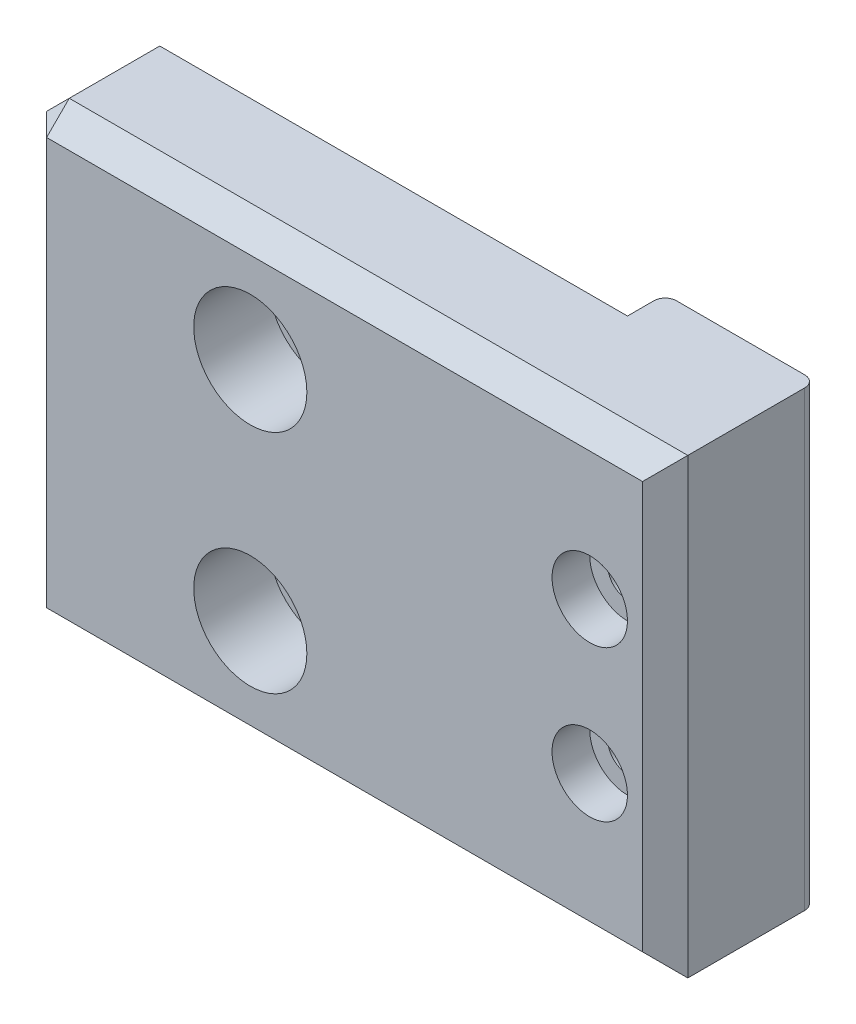
ISO-10303-21;
HEADER;
FILE_DESCRIPTION(('STEP AP214'),'2;1');
FILE_NAME('part.step','',(''),(''),'','','');
FILE_SCHEMA(('AUTOMOTIVE_DESIGN { 1 0 10303 214 1 1 1 1 }'));
ENDSEC;
DATA;
#1=APPLICATION_CONTEXT('core data for automotive mechanical design processes');
#2=APPLICATION_PROTOCOL_DEFINITION('international standard','automotive_design',2000,#1);
#3=PRODUCT_CONTEXT('',#1,'mechanical');
#4=PRODUCT('Part','Part','',(#3));
#5=PRODUCT_RELATED_PRODUCT_CATEGORY('part','',(#4));
#6=PRODUCT_DEFINITION_FORMATION('','',#4);
#7=PRODUCT_DEFINITION_CONTEXT('part definition',#1,'design');
#8=PRODUCT_DEFINITION('design','',#6,#7);
#9=PRODUCT_DEFINITION_SHAPE('','',#8);
#10=(LENGTH_UNIT() NAMED_UNIT(*) SI_UNIT(.MILLI.,.METRE.));
#11=(NAMED_UNIT(*) PLANE_ANGLE_UNIT() SI_UNIT($,.RADIAN.));
#12=(NAMED_UNIT(*) SI_UNIT($,.STERADIAN.) SOLID_ANGLE_UNIT());
#13=UNCERTAINTY_MEASURE_WITH_UNIT(LENGTH_MEASURE(1.E-05),#10,'distance_accuracy_value','');
#14=(GEOMETRIC_REPRESENTATION_CONTEXT(3) GLOBAL_UNCERTAINTY_ASSIGNED_CONTEXT((#13)) GLOBAL_UNIT_ASSIGNED_CONTEXT((#10,
#11,#12)) REPRESENTATION_CONTEXT('',''));
#15=CARTESIAN_POINT('',(0.,0.,0.));
#16=DIRECTION('',(0.,0.,1.));
#17=DIRECTION('',(1.,0.,0.));
#18=AXIS2_PLACEMENT_3D('',#15,#16,#17);
#19=CARTESIAN_POINT('',(-55.,15.,-5.));
#20=DIRECTION('',(0.,0.,1.));
#21=DIRECTION('',(1.,0.,0.));
#22=AXIS2_PLACEMENT_3D('',#19,#20,#21);
#23=CYLINDRICAL_SURFACE('',#22,4.1);
#24=CARTESIAN_POINT('',(-55.,15.,0.));
#25=DIRECTION('',(0.,0.,1.));
#26=DIRECTION('',(1.,0.,0.));
#27=AXIS2_PLACEMENT_3D('',#24,#25,#26);
#28=CIRCLE('',#27,4.1);
#29=CARTESIAN_POINT('',(-50.9,15.,0.));
#30=VERTEX_POINT('',#29);
#31=EDGE_CURVE('E218',#30,#30,#28,.T.);
#32=ORIENTED_EDGE('',*,*,#31,.F.);
#33=EDGE_LOOP('',(#32));
#34=FACE_BOUND('',#33,.T.);
#35=CARTESIAN_POINT('',(-55.,15.,5.));
#36=DIRECTION('',(0.,0.,1.));
#37=DIRECTION('',(1.,0.,0.));
#38=AXIS2_PLACEMENT_3D('',#35,#36,#37);
#39=CIRCLE('',#38,4.1);
#40=CARTESIAN_POINT('',(-50.9,15.,5.));
#41=VERTEX_POINT('',#40);
#42=EDGE_CURVE('E223',#41,#41,#39,.F.);
#43=ORIENTED_EDGE('',*,*,#42,.F.);
#44=EDGE_LOOP('',(#43));
#45=FACE_BOUND('',#44,.T.);
#46=ADVANCED_FACE('F41',(#34,#45),#23,.F.);
#47=CARTESIAN_POINT('',(-55.,45.,-5.));
#48=DIRECTION('',(0.,0.,1.));
#49=DIRECTION('',(1.,0.,0.));
#50=AXIS2_PLACEMENT_3D('',#47,#48,#49);
#51=CYLINDRICAL_SURFACE('',#50,4.1);
#52=CARTESIAN_POINT('',(-55.,45.,0.));
#53=DIRECTION('',(0.,0.,1.));
#54=DIRECTION('',(1.,0.,0.));
#55=AXIS2_PLACEMENT_3D('',#52,#53,#54);
#56=CIRCLE('',#55,4.1);
#57=CARTESIAN_POINT('',(-50.9,45.,0.));
#58=VERTEX_POINT('',#57);
#59=EDGE_CURVE('E222',#58,#58,#56,.T.);
#60=ORIENTED_EDGE('',*,*,#59,.F.);
#61=EDGE_LOOP('',(#60));
#62=FACE_BOUND('',#61,.T.);
#63=CARTESIAN_POINT('',(-55.,45.,5.));
#64=DIRECTION('',(0.,0.,1.));
#65=DIRECTION('',(1.,0.,0.));
#66=AXIS2_PLACEMENT_3D('',#63,#64,#65);
#67=CIRCLE('',#66,4.1);
#68=CARTESIAN_POINT('',(-50.9,45.,5.));
#69=VERTEX_POINT('',#68);
#70=EDGE_CURVE('E228',#69,#69,#67,.F.);
#71=ORIENTED_EDGE('',*,*,#70,.F.);
#72=EDGE_LOOP('',(#71));
#73=FACE_BOUND('',#72,.T.);
#74=ADVANCED_FACE('F379',(#62,#73),#51,.F.);
#75=CARTESIAN_POINT('',(-10.,20.,-5.));
#76=DIRECTION('',(0.,0.,1.));
#77=DIRECTION('',(1.,0.,0.));
#78=AXIS2_PLACEMENT_3D('',#75,#76,#77);
#79=CYLINDRICAL_SURFACE('',#78,2.6);
#80=CARTESIAN_POINT('',(-10.,20.,-5.));
#81=DIRECTION('',(0.,0.,1.));
#82=DIRECTION('',(1.,0.,0.));
#83=AXIS2_PLACEMENT_3D('',#80,#81,#82);
#84=CIRCLE('',#83,2.6);
#85=CARTESIAN_POINT('',(-7.4,20.,-5.));
#86=VERTEX_POINT('',#85);
#87=EDGE_CURVE('E192',#86,#86,#84,.T.);
#88=ORIENTED_EDGE('',*,*,#87,.F.);
#89=EDGE_LOOP('',(#88));
#90=FACE_BOUND('',#89,.T.);
#91=CARTESIAN_POINT('',(-10.,20.,10.));
#92=DIRECTION('',(0.,0.,1.));
#93=DIRECTION('',(1.,0.,0.));
#94=AXIS2_PLACEMENT_3D('',#91,#92,#93);
#95=CIRCLE('',#94,2.6);
#96=CARTESIAN_POINT('',(-7.4,20.,10.));
#97=VERTEX_POINT('',#96);
#98=EDGE_CURVE('E187',#97,#97,#95,.F.);
#99=ORIENTED_EDGE('',*,*,#98,.F.);
#100=EDGE_LOOP('',(#99));
#101=FACE_BOUND('',#100,.T.);
#102=ADVANCED_FACE('F385',(#90,#101),#79,.F.);
#103=CARTESIAN_POINT('',(-10.,40.,-5.));
#104=DIRECTION('',(0.,0.,1.));
#105=DIRECTION('',(1.,0.,0.));
#106=AXIS2_PLACEMENT_3D('',#103,#104,#105);
#107=CYLINDRICAL_SURFACE('',#106,2.6);
#108=CARTESIAN_POINT('',(-10.,40.,-5.));
#109=DIRECTION('',(0.,0.,1.));
#110=DIRECTION('',(1.,0.,0.));
#111=AXIS2_PLACEMENT_3D('',#108,#109,#110);
#112=CIRCLE('',#111,2.6);
#113=CARTESIAN_POINT('',(-7.4,40.,-5.));
#114=VERTEX_POINT('',#113);
#115=EDGE_CURVE('E161',#114,#114,#112,.T.);
#116=ORIENTED_EDGE('',*,*,#115,.F.);
#117=EDGE_LOOP('',(#116));
#118=FACE_BOUND('',#117,.T.);
#119=CARTESIAN_POINT('',(-10.,40.,10.));
#120=DIRECTION('',(0.,0.,1.));
#121=DIRECTION('',(1.,0.,0.));
#122=AXIS2_PLACEMENT_3D('',#119,#120,#121);
#123=CIRCLE('',#122,2.6);
#124=CARTESIAN_POINT('',(-7.4,40.,10.));
#125=VERTEX_POINT('',#124);
#126=EDGE_CURVE('E183',#125,#125,#123,.F.);
#127=ORIENTED_EDGE('',*,*,#126,.F.);
#128=EDGE_LOOP('',(#127));
#129=FACE_BOUND('',#128,.T.);
#130=ADVANCED_FACE('F406',(#118,#129),#107,.F.);
#131=CARTESIAN_POINT('',(-85.,0.,15.));
#132=DIRECTION('',(0.,1.,0.));
#133=DIRECTION('',(-1.,0.,0.));
#134=AXIS2_PLACEMENT_3D('',#131,#132,#133);
#135=PLANE('',#134);
#136=DIRECTION('',(-1.,0.,0.));
#137=VECTOR('',#136,1.);
#138=CARTESIAN_POINT('',(-85.,0.,12.));
#139=LINE('',#138,#137);
#140=CARTESIAN_POINT('',(0.,0.,12.));
#141=VERTEX_POINT('',#140);
#142=CARTESIAN_POINT('',(-82.,0.,12.));
#143=VERTEX_POINT('',#142);
#144=EDGE_CURVE('E256',#141,#143,#139,.T.);
#145=ORIENTED_EDGE('',*,*,#144,.T.);
#146=DIRECTION('',(0.,0.,-1.));
#147=VECTOR('',#146,1.);
#148=CARTESIAN_POINT('',(-82.,0.,15.));
#149=LINE('',#148,#147);
#150=CARTESIAN_POINT('',(-82.,0.,0.));
#151=VERTEX_POINT('',#150);
#152=EDGE_CURVE('E259',#143,#151,#149,.T.);
#153=ORIENTED_EDGE('',*,*,#152,.T.);
#154=DIRECTION('',(1.,0.,0.));
#155=VECTOR('',#154,1.);
#156=CARTESIAN_POINT('',(-85.,0.,0.));
#157=LINE('',#156,#155);
#158=CARTESIAN_POINT('',(-20.,0.,0.));
#159=VERTEX_POINT('',#158);
#160=EDGE_CURVE('E149',#151,#159,#157,.T.);
#161=ORIENTED_EDGE('',*,*,#160,.T.);
#162=DIRECTION('',(0.,0.,1.));
#163=VECTOR('',#162,1.);
#164=CARTESIAN_POINT('',(-20.,0.,-5.));
#165=LINE('',#164,#163);
#166=CARTESIAN_POINT('',(-20.,0.,-3.5));
#167=VERTEX_POINT('',#166);
#168=EDGE_CURVE('E150',#167,#159,#165,.T.);
#169=ORIENTED_EDGE('',*,*,#168,.F.);
#170=CARTESIAN_POINT('',(-18.5,0.,-3.5));
#171=DIRECTION('',(0.,1.,0.));
#172=DIRECTION('',(-1.,0.,0.));
#173=AXIS2_PLACEMENT_3D('',#170,#171,#172);
#174=CIRCLE('',#173,1.5);
#175=CARTESIAN_POINT('',(-18.5,0.,-5.));
#176=VERTEX_POINT('',#175);
#177=EDGE_CURVE('E199',#167,#176,#174,.F.);
#178=ORIENTED_EDGE('',*,*,#177,.T.);
#179=DIRECTION('',(1.,0.,0.));
#180=VECTOR('',#179,1.);
#181=CARTESIAN_POINT('',(-20.,0.,-5.));
#182=LINE('',#181,#180);
#183=CARTESIAN_POINT('',(-1.5,0.,-5.));
#184=VERTEX_POINT('',#183);
#185=EDGE_CURVE('E160',#176,#184,#182,.T.);
#186=ORIENTED_EDGE('',*,*,#185,.T.);
#187=CARTESIAN_POINT('',(-1.5,0.,-3.5));
#188=DIRECTION('',(0.,1.,0.));
#189=DIRECTION('',(-1.,0.,0.));
#190=AXIS2_PLACEMENT_3D('',#187,#188,#189);
#191=CIRCLE('',#190,1.5);
#192=CARTESIAN_POINT('',(0.,0.,-3.5));
#193=VERTEX_POINT('',#192);
#194=EDGE_CURVE('E195',#184,#193,#191,.F.);
#195=ORIENTED_EDGE('',*,*,#194,.T.);
#196=DIRECTION('',(0.,0.,-1.));
#197=VECTOR('',#196,1.);
#198=CARTESIAN_POINT('',(0.,0.,15.));
#199=LINE('',#198,#197);
#200=EDGE_CURVE('E179',#141,#193,#199,.T.);
#201=ORIENTED_EDGE('',*,*,#200,.F.);
#202=EDGE_LOOP('',(#145,#153,#161,#169,#178,#186,#195,#201));
#203=FACE_BOUND('',#202,.T.);
#204=ADVANCED_FACE('F408',(#203),#135,.F.);
#205=CARTESIAN_POINT('',(0.,0.,15.));
#206=DIRECTION('',(-1.,0.,0.));
#207=DIRECTION('',(0.,0.,1.));
#208=AXIS2_PLACEMENT_3D('',#205,#206,#207);
#209=PLANE('',#208);
#210=DIRECTION('',(0.,0.,-1.));
#211=VECTOR('',#210,1.);
#212=CARTESIAN_POINT('',(0.,60.,15.));
#213=LINE('',#212,#211);
#214=CARTESIAN_POINT('',(0.,60.,12.));
#215=VERTEX_POINT('',#214);
#216=CARTESIAN_POINT('',(0.,60.,-3.5));
#217=VERTEX_POINT('',#216);
#218=EDGE_CURVE('E172',#215,#217,#213,.T.);
#219=ORIENTED_EDGE('',*,*,#218,.F.);
#220=DIRECTION('',(0.,-1.,0.));
#221=VECTOR('',#220,1.);
#222=CARTESIAN_POINT('',(0.,0.,12.));
#223=LINE('',#222,#221);
#224=EDGE_CURVE('E11',#215,#141,#223,.T.);
#225=ORIENTED_EDGE('',*,*,#224,.T.);
#226=ORIENTED_EDGE('',*,*,#200,.T.);
#227=DIRECTION('',(0.,1.,0.));
#228=VECTOR('',#227,1.);
#229=CARTESIAN_POINT('',(0.,0.,-3.5));
#230=LINE('',#229,#228);
#231=EDGE_CURVE('E213',#193,#217,#230,.T.);
#232=ORIENTED_EDGE('',*,*,#231,.T.);
#233=EDGE_LOOP('',(#219,#225,#226,#232));
#234=FACE_BOUND('',#233,.T.);
#235=ADVANCED_FACE('F414',(#234),#209,.F.);
#236=CARTESIAN_POINT('',(0.,60.,15.));
#237=DIRECTION('',(0.,-1.,0.));
#238=DIRECTION('',(1.,0.,0.));
#239=AXIS2_PLACEMENT_3D('',#236,#237,#238);
#240=PLANE('',#239);
#241=DIRECTION('',(-1.,0.,0.));
#242=VECTOR('',#241,1.);
#243=CARTESIAN_POINT('',(0.,60.,0.));
#244=LINE('',#243,#242);
#245=CARTESIAN_POINT('',(-20.,60.,0.));
#246=VERTEX_POINT('',#245);
#247=CARTESIAN_POINT('',(-82.,60.,0.));
#248=VERTEX_POINT('',#247);
#249=EDGE_CURVE('E140',#246,#248,#244,.T.);
#250=ORIENTED_EDGE('',*,*,#249,.T.);
#251=DIRECTION('',(0.,0.,1.));
#252=VECTOR('',#251,1.);
#253=CARTESIAN_POINT('',(-82.,60.,15.));
#254=LINE('',#253,#252);
#255=CARTESIAN_POINT('',(-82.,60.,12.));
#256=VERTEX_POINT('',#255);
#257=EDGE_CURVE('E253',#248,#256,#254,.T.);
#258=ORIENTED_EDGE('',*,*,#257,.T.);
#259=DIRECTION('',(1.,0.,0.));
#260=VECTOR('',#259,1.);
#261=CARTESIAN_POINT('',(0.,60.,12.));
#262=LINE('',#261,#260);
#263=EDGE_CURVE('E250',#256,#215,#262,.T.);
#264=ORIENTED_EDGE('',*,*,#263,.T.);
#265=ORIENTED_EDGE('',*,*,#218,.T.);
#266=CARTESIAN_POINT('',(-1.5,60.,-3.5));
#267=DIRECTION('',(0.,-1.,0.));
#268=DIRECTION('',(1.,0.,0.));
#269=AXIS2_PLACEMENT_3D('',#266,#267,#268);
#270=CIRCLE('',#269,1.5);
#271=CARTESIAN_POINT('',(-1.5,60.,-5.));
#272=VERTEX_POINT('',#271);
#273=EDGE_CURVE('E208',#217,#272,#270,.F.);
#274=ORIENTED_EDGE('',*,*,#273,.T.);
#275=DIRECTION('',(-1.,0.,0.));
#276=VECTOR('',#275,1.);
#277=CARTESIAN_POINT('',(-20.,60.,-5.));
#278=LINE('',#277,#276);
#279=CARTESIAN_POINT('',(-18.5,60.,-5.));
#280=VERTEX_POINT('',#279);
#281=EDGE_CURVE('E338',#272,#280,#278,.T.);
#282=ORIENTED_EDGE('',*,*,#281,.T.);
#283=CARTESIAN_POINT('',(-18.5,60.,-3.5));
#284=DIRECTION('',(0.,-1.,0.));
#285=DIRECTION('',(1.,0.,0.));
#286=AXIS2_PLACEMENT_3D('',#283,#284,#285);
#287=CIRCLE('',#286,1.5);
#288=CARTESIAN_POINT('',(-20.,60.,-3.5));
#289=VERTEX_POINT('',#288);
#290=EDGE_CURVE('E144',#280,#289,#287,.F.);
#291=ORIENTED_EDGE('',*,*,#290,.T.);
#292=DIRECTION('',(0.,0.,1.));
#293=VECTOR('',#292,1.);
#294=CARTESIAN_POINT('',(-20.,60.,-5.));
#295=LINE('',#294,#293);
#296=EDGE_CURVE('E136',#289,#246,#295,.T.);
#297=ORIENTED_EDGE('',*,*,#296,.T.);
#298=EDGE_LOOP('',(#250,#258,#264,#265,#274,#282,#291,#297));
#299=FACE_BOUND('',#298,.T.);
#300=ADVANCED_FACE('F138',(#299),#240,.F.);
#301=CARTESIAN_POINT('',(-85.,60.,15.));
#302=DIRECTION('',(1.,0.,0.));
#303=DIRECTION('',(0.,0.,-1.));
#304=AXIS2_PLACEMENT_3D('',#301,#302,#303);
#305=PLANE('',#304);
#306=DIRECTION('',(0.,1.,0.));
#307=VECTOR('',#306,1.);
#308=CARTESIAN_POINT('',(-85.,60.,12.));
#309=LINE('',#308,#307);
#310=CARTESIAN_POINT('',(-85.,3.,12.));
#311=VERTEX_POINT('',#310);
#312=CARTESIAN_POINT('',(-85.,57.,12.));
#313=VERTEX_POINT('',#312);
#314=EDGE_CURVE('E217',#311,#313,#309,.T.);
#315=ORIENTED_EDGE('',*,*,#314,.T.);
#316=DIRECTION('',(0.,0.,-1.));
#317=VECTOR('',#316,1.);
#318=CARTESIAN_POINT('',(-85.,57.,15.));
#319=LINE('',#318,#317);
#320=CARTESIAN_POINT('',(-85.,57.,0.));
#321=VERTEX_POINT('',#320);
#322=EDGE_CURVE('E241',#313,#321,#319,.T.);
#323=ORIENTED_EDGE('',*,*,#322,.T.);
#324=DIRECTION('',(0.,-1.,0.));
#325=VECTOR('',#324,1.);
#326=CARTESIAN_POINT('',(-85.,60.,0.));
#327=LINE('',#326,#325);
#328=CARTESIAN_POINT('',(-85.,3.,0.));
#329=VERTEX_POINT('',#328);
#330=EDGE_CURVE('E167',#321,#329,#327,.T.);
#331=ORIENTED_EDGE('',*,*,#330,.T.);
#332=DIRECTION('',(0.,0.,1.));
#333=VECTOR('',#332,1.);
#334=CARTESIAN_POINT('',(-85.,3.,15.));
#335=LINE('',#334,#333);
#336=EDGE_CURVE('E238',#329,#311,#335,.T.);
#337=ORIENTED_EDGE('',*,*,#336,.T.);
#338=EDGE_LOOP('',(#315,#323,#331,#337));
#339=FACE_BOUND('',#338,.T.);
#340=ADVANCED_FACE('F353',(#339),#305,.F.);
#341=CARTESIAN_POINT('',(0.,0.,15.));
#342=DIRECTION('',(0.,0.,1.));
#343=DIRECTION('',(1.,0.,0.));
#344=AXIS2_PLACEMENT_3D('',#341,#342,#343);
#345=PLANE('',#344);
#346=DIRECTION('',(-1.,0.,0.));
#347=VECTOR('',#346,1.);
#348=CARTESIAN_POINT('',(-85.,57.,15.));
#349=LINE('',#348,#347);
#350=CARTESIAN_POINT('',(-3.,57.,15.));
#351=VERTEX_POINT('',#350);
#352=CARTESIAN_POINT('',(-82.,57.,15.));
#353=VERTEX_POINT('',#352);
#354=EDGE_CURVE('E262',#351,#353,#349,.T.);
#355=ORIENTED_EDGE('',*,*,#354,.T.);
#356=DIRECTION('',(0.,-1.,0.));
#357=VECTOR('',#356,1.);
#358=CARTESIAN_POINT('',(-82.,0.,15.));
#359=LINE('',#358,#357);
#360=CARTESIAN_POINT('',(-82.,2.99999999999999,15.));
#361=VERTEX_POINT('',#360);
#362=EDGE_CURVE('E52',#353,#361,#359,.T.);
#363=ORIENTED_EDGE('',*,*,#362,.T.);
#364=DIRECTION('',(1.,0.,0.));
#365=VECTOR('',#364,1.);
#366=CARTESIAN_POINT('',(0.,3.,15.));
#367=LINE('',#366,#365);
#368=CARTESIAN_POINT('',(-3.,3.,15.));
#369=VERTEX_POINT('',#368);
#370=EDGE_CURVE('E68',#361,#369,#367,.T.);
#371=ORIENTED_EDGE('',*,*,#370,.T.);
#372=DIRECTION('',(0.,1.,0.));
#373=VECTOR('',#372,1.);
#374=CARTESIAN_POINT('',(-3.,60.,15.));
#375=LINE('',#374,#373);
#376=EDGE_CURVE('E265',#369,#351,#375,.T.);
#377=ORIENTED_EDGE('',*,*,#376,.T.);
#378=EDGE_LOOP('',(#355,#363,#371,#377));
#379=FACE_BOUND('',#378,.T.);
#380=CARTESIAN_POINT('',(-55.,45.,15.));
#381=DIRECTION('',(0.,0.,1.));
#382=DIRECTION('',(1.,0.,0.));
#383=AXIS2_PLACEMENT_3D('',#380,#381,#382);
#384=CIRCLE('',#383,7.5);
#385=CARTESIAN_POINT('',(-47.5,45.,15.));
#386=VERTEX_POINT('',#385);
#387=EDGE_CURVE('E311',#386,#386,#384,.T.);
#388=ORIENTED_EDGE('',*,*,#387,.F.);
#389=EDGE_LOOP('',(#388));
#390=FACE_BOUND('',#389,.T.);
#391=CARTESIAN_POINT('',(-55.,15.,15.));
#392=DIRECTION('',(0.,0.,1.));
#393=DIRECTION('',(1.,0.,0.));
#394=AXIS2_PLACEMENT_3D('',#391,#392,#393);
#395=CIRCLE('',#394,7.5);
#396=CARTESIAN_POINT('',(-47.5,15.,15.));
#397=VERTEX_POINT('',#396);
#398=EDGE_CURVE('E299',#397,#397,#395,.T.);
#399=ORIENTED_EDGE('',*,*,#398,.F.);
#400=EDGE_LOOP('',(#399));
#401=FACE_BOUND('',#400,.T.);
#402=CARTESIAN_POINT('',(-10.,40.,15.));
#403=DIRECTION('',(0.,0.,1.));
#404=DIRECTION('',(1.,0.,0.));
#405=AXIS2_PLACEMENT_3D('',#402,#403,#404);
#406=CIRCLE('',#405,5.);
#407=CARTESIAN_POINT('',(-5.,40.,15.));
#408=VERTEX_POINT('',#407);
#409=EDGE_CURVE('E318',#408,#408,#406,.T.);
#410=ORIENTED_EDGE('',*,*,#409,.F.);
#411=EDGE_LOOP('',(#410));
#412=FACE_BOUND('',#411,.T.);
#413=CARTESIAN_POINT('',(-10.,20.,15.));
#414=DIRECTION('',(0.,0.,1.));
#415=DIRECTION('',(1.,0.,0.));
#416=AXIS2_PLACEMENT_3D('',#413,#414,#415);
#417=CIRCLE('',#416,5.);
#418=CARTESIAN_POINT('',(-5.,20.,15.));
#419=VERTEX_POINT('',#418);
#420=EDGE_CURVE('E227',#419,#419,#417,.T.);
#421=ORIENTED_EDGE('',*,*,#420,.F.);
#422=EDGE_LOOP('',(#421));
#423=FACE_BOUND('',#422,.T.);
#424=ADVANCED_FACE('F350',(#379,#390,#401,#412,#423),#345,.T.);
#425=CARTESIAN_POINT('',(0.,0.,0.));
#426=DIRECTION('',(0.,0.,1.));
#427=DIRECTION('',(1.,0.,0.));
#428=AXIS2_PLACEMENT_3D('',#425,#426,#427);
#429=PLANE('',#428);
#430=ORIENTED_EDGE('',*,*,#59,.T.);
#431=EDGE_LOOP('',(#430));
#432=FACE_BOUND('',#431,.T.);
#433=ORIENTED_EDGE('',*,*,#31,.T.);
#434=EDGE_LOOP('',(#433));
#435=FACE_BOUND('',#434,.T.);
#436=ORIENTED_EDGE('',*,*,#330,.F.);
#437=DIRECTION('',(-0.707106781186549,-0.707106781186546,0.));
#438=VECTOR('',#437,1.);
#439=CARTESIAN_POINT('',(-85.,57.,0.));
#440=LINE('',#439,#438);
#441=EDGE_CURVE('E165',#321,#248,#440,.F.);
#442=ORIENTED_EDGE('',*,*,#441,.T.);
#443=ORIENTED_EDGE('',*,*,#249,.F.);
#444=DIRECTION('',(0.,-1.,0.));
#445=VECTOR('',#444,1.);
#446=CARTESIAN_POINT('',(-20.,60.,0.));
#447=LINE('',#446,#445);
#448=EDGE_CURVE('E154',#246,#159,#447,.T.);
#449=ORIENTED_EDGE('',*,*,#448,.T.);
#450=ORIENTED_EDGE('',*,*,#160,.F.);
#451=DIRECTION('',(0.707106781186546,-0.707106781186549,0.));
#452=VECTOR('',#451,1.);
#453=CARTESIAN_POINT('',(-82.,0.,0.));
#454=LINE('',#453,#452);
#455=EDGE_CURVE('E245',#151,#329,#454,.F.);
#456=ORIENTED_EDGE('',*,*,#455,.T.);
#457=EDGE_LOOP('',(#436,#442,#443,#449,#450,#456));
#458=FACE_BOUND('',#457,.T.);
#459=ADVANCED_FACE('F164',(#432,#435,#458),#429,.F.);
#460=CARTESIAN_POINT('',(-20.,60.,-5.));
#461=DIRECTION('',(-1.,0.,0.));
#462=DIRECTION('',(0.,-1.,0.));
#463=AXIS2_PLACEMENT_3D('',#460,#461,#462);
#464=PLANE('',#463);
#465=ORIENTED_EDGE('',*,*,#296,.F.);
#466=DIRECTION('',(0.,-1.,0.));
#467=VECTOR('',#466,1.);
#468=CARTESIAN_POINT('',(-20.,0.,-3.5));
#469=LINE('',#468,#467);
#470=EDGE_CURVE('E182',#289,#167,#469,.T.);
#471=ORIENTED_EDGE('',*,*,#470,.T.);
#472=ORIENTED_EDGE('',*,*,#168,.T.);
#473=ORIENTED_EDGE('',*,*,#448,.F.);
#474=EDGE_LOOP('',(#465,#471,#472,#473));
#475=FACE_BOUND('',#474,.T.);
#476=ADVANCED_FACE('F155',(#475),#464,.T.);
#477=CARTESIAN_POINT('',(0.,0.,-5.));
#478=DIRECTION('',(0.,0.,1.));
#479=DIRECTION('',(1.,0.,0.));
#480=AXIS2_PLACEMENT_3D('',#477,#478,#479);
#481=PLANE('',#480);
#482=ORIENTED_EDGE('',*,*,#115,.T.);
#483=EDGE_LOOP('',(#482));
#484=FACE_BOUND('',#483,.T.);
#485=ORIENTED_EDGE('',*,*,#87,.T.);
#486=EDGE_LOOP('',(#485));
#487=FACE_BOUND('',#486,.T.);
#488=ORIENTED_EDGE('',*,*,#185,.F.);
#489=DIRECTION('',(0.,-1.,0.));
#490=VECTOR('',#489,1.);
#491=CARTESIAN_POINT('',(-18.5,60.,-5.));
#492=LINE('',#491,#490);
#493=EDGE_CURVE('E205',#176,#280,#492,.F.);
#494=ORIENTED_EDGE('',*,*,#493,.T.);
#495=ORIENTED_EDGE('',*,*,#281,.F.);
#496=DIRECTION('',(0.,1.,0.));
#497=VECTOR('',#496,1.);
#498=CARTESIAN_POINT('',(-1.5,0.,-5.));
#499=LINE('',#498,#497);
#500=EDGE_CURVE('E202',#272,#184,#499,.F.);
#501=ORIENTED_EDGE('',*,*,#500,.T.);
#502=EDGE_LOOP('',(#488,#494,#495,#501));
#503=FACE_BOUND('',#502,.T.);
#504=ADVANCED_FACE('F395',(#484,#487,#503),#481,.F.);
#505=CARTESIAN_POINT('',(-10.,40.,10.));
#506=DIRECTION('',(0.,0.,1.));
#507=DIRECTION('',(1.,0.,0.));
#508=AXIS2_PLACEMENT_3D('',#505,#506,#507);
#509=PLANE('',#508);
#510=CARTESIAN_POINT('',(-10.,40.,10.));
#511=DIRECTION('',(0.,0.,1.));
#512=DIRECTION('',(1.,0.,0.));
#513=AXIS2_PLACEMENT_3D('',#510,#511,#512);
#514=CIRCLE('',#513,5.);
#515=CARTESIAN_POINT('',(-5.,40.,10.));
#516=VERTEX_POINT('',#515);
#517=EDGE_CURVE('E188',#516,#516,#514,.T.);
#518=ORIENTED_EDGE('',*,*,#517,.T.);
#519=EDGE_LOOP('',(#518));
#520=FACE_BOUND('',#519,.T.);
#521=ORIENTED_EDGE('',*,*,#126,.T.);
#522=EDGE_LOOP('',(#521));
#523=FACE_BOUND('',#522,.T.);
#524=ADVANCED_FACE('F392',(#520,#523),#509,.T.);
#525=CARTESIAN_POINT('',(-10.,40.,10.));
#526=DIRECTION('',(0.,0.,1.));
#527=DIRECTION('',(1.,0.,0.));
#528=AXIS2_PLACEMENT_3D('',#525,#526,#527);
#529=CYLINDRICAL_SURFACE('',#528,5.);
#530=ORIENTED_EDGE('',*,*,#517,.F.);
#531=EDGE_LOOP('',(#530));
#532=FACE_BOUND('',#531,.T.);
#533=ORIENTED_EDGE('',*,*,#409,.T.);
#534=EDGE_LOOP('',(#533));
#535=FACE_BOUND('',#534,.T.);
#536=ADVANCED_FACE('F373',(#532,#535),#529,.F.);
#537=CARTESIAN_POINT('',(-10.,20.,10.));
#538=DIRECTION('',(0.,0.,1.));
#539=DIRECTION('',(1.,0.,0.));
#540=AXIS2_PLACEMENT_3D('',#537,#538,#539);
#541=PLANE('',#540);
#542=CARTESIAN_POINT('',(-10.,20.,10.));
#543=DIRECTION('',(0.,0.,1.));
#544=DIRECTION('',(1.,0.,0.));
#545=AXIS2_PLACEMENT_3D('',#542,#543,#544);
#546=CIRCLE('',#545,5.);
#547=CARTESIAN_POINT('',(-5.,20.,10.));
#548=VERTEX_POINT('',#547);
#549=EDGE_CURVE('E322',#548,#548,#546,.T.);
#550=ORIENTED_EDGE('',*,*,#549,.T.);
#551=EDGE_LOOP('',(#550));
#552=FACE_BOUND('',#551,.T.);
#553=ORIENTED_EDGE('',*,*,#98,.T.);
#554=EDGE_LOOP('',(#553));
#555=FACE_BOUND('',#554,.T.);
#556=ADVANCED_FACE('F363',(#552,#555),#541,.T.);
#557=CARTESIAN_POINT('',(-10.,20.,10.));
#558=DIRECTION('',(0.,0.,1.));
#559=DIRECTION('',(1.,0.,0.));
#560=AXIS2_PLACEMENT_3D('',#557,#558,#559);
#561=CYLINDRICAL_SURFACE('',#560,5.);
#562=ORIENTED_EDGE('',*,*,#549,.F.);
#563=EDGE_LOOP('',(#562));
#564=FACE_BOUND('',#563,.T.);
#565=ORIENTED_EDGE('',*,*,#420,.T.);
#566=EDGE_LOOP('',(#565));
#567=FACE_BOUND('',#566,.T.);
#568=ADVANCED_FACE('F360',(#564,#567),#561,.F.);
#569=CARTESIAN_POINT('',(-18.5,60.,-3.5));
#570=DIRECTION('',(0.,1.,0.));
#571=DIRECTION('',(-1.,0.,0.));
#572=AXIS2_PLACEMENT_3D('',#569,#570,#571);
#573=CYLINDRICAL_SURFACE('',#572,1.5);
#574=ORIENTED_EDGE('',*,*,#290,.F.);
#575=ORIENTED_EDGE('',*,*,#493,.F.);
#576=ORIENTED_EDGE('',*,*,#177,.F.);
#577=ORIENTED_EDGE('',*,*,#470,.F.);
#578=EDGE_LOOP('',(#574,#575,#576,#577));
#579=FACE_BOUND('',#578,.T.);
#580=ADVANCED_FACE('F362',(#579),#573,.T.);
#581=CARTESIAN_POINT('',(-1.5,0.,-3.5));
#582=DIRECTION('',(0.,1.,0.));
#583=DIRECTION('',(0.,0.,1.));
#584=AXIS2_PLACEMENT_3D('',#581,#582,#583);
#585=CYLINDRICAL_SURFACE('',#584,1.5);
#586=ORIENTED_EDGE('',*,*,#194,.F.);
#587=ORIENTED_EDGE('',*,*,#500,.F.);
#588=ORIENTED_EDGE('',*,*,#273,.F.);
#589=ORIENTED_EDGE('',*,*,#231,.F.);
#590=EDGE_LOOP('',(#586,#587,#588,#589));
#591=FACE_BOUND('',#590,.T.);
#592=ADVANCED_FACE('F370',(#591),#585,.T.);
#593=CARTESIAN_POINT('',(-55.,45.,5.));
#594=DIRECTION('',(0.,0.,1.));
#595=DIRECTION('',(1.,0.,0.));
#596=AXIS2_PLACEMENT_3D('',#593,#594,#595);
#597=PLANE('',#596);
#598=CARTESIAN_POINT('',(-55.,45.,5.));
#599=DIRECTION('',(0.,0.,1.));
#600=DIRECTION('',(1.,0.,0.));
#601=AXIS2_PLACEMENT_3D('',#598,#599,#600);
#602=CIRCLE('',#601,7.5);
#603=CARTESIAN_POINT('',(-47.5,45.,5.));
#604=VERTEX_POINT('',#603);
#605=EDGE_CURVE('E232',#604,#604,#602,.T.);
#606=ORIENTED_EDGE('',*,*,#605,.T.);
#607=EDGE_LOOP('',(#606));
#608=FACE_BOUND('',#607,.T.);
#609=ORIENTED_EDGE('',*,*,#70,.T.);
#610=EDGE_LOOP('',(#609));
#611=FACE_BOUND('',#610,.T.);
#612=ADVANCED_FACE('F439',(#608,#611),#597,.T.);
#613=CARTESIAN_POINT('',(-55.,45.,5.));
#614=DIRECTION('',(0.,0.,1.));
#615=DIRECTION('',(1.,0.,0.));
#616=AXIS2_PLACEMENT_3D('',#613,#614,#615);
#617=CYLINDRICAL_SURFACE('',#616,7.5);
#618=ORIENTED_EDGE('',*,*,#605,.F.);
#619=EDGE_LOOP('',(#618));
#620=FACE_BOUND('',#619,.T.);
#621=ORIENTED_EDGE('',*,*,#387,.T.);
#622=EDGE_LOOP('',(#621));
#623=FACE_BOUND('',#622,.T.);
#624=ADVANCED_FACE('F348',(#620,#623),#617,.F.);
#625=CARTESIAN_POINT('',(-55.,15.,5.));
#626=DIRECTION('',(0.,0.,1.));
#627=DIRECTION('',(1.,0.,0.));
#628=AXIS2_PLACEMENT_3D('',#625,#626,#627);
#629=PLANE('',#628);
#630=CARTESIAN_POINT('',(-55.,15.,5.));
#631=DIRECTION('',(0.,0.,1.));
#632=DIRECTION('',(1.,0.,0.));
#633=AXIS2_PLACEMENT_3D('',#630,#631,#632);
#634=CIRCLE('',#633,7.5);
#635=CARTESIAN_POINT('',(-47.5,15.,5.));
#636=VERTEX_POINT('',#635);
#637=EDGE_CURVE('E305',#636,#636,#634,.T.);
#638=ORIENTED_EDGE('',*,*,#637,.T.);
#639=EDGE_LOOP('',(#638));
#640=FACE_BOUND('',#639,.T.);
#641=ORIENTED_EDGE('',*,*,#42,.T.);
#642=EDGE_LOOP('',(#641));
#643=FACE_BOUND('',#642,.T.);
#644=ADVANCED_FACE('F515',(#640,#643),#629,.T.);
#645=CARTESIAN_POINT('',(-55.,15.,5.));
#646=DIRECTION('',(0.,0.,1.));
#647=DIRECTION('',(1.,0.,0.));
#648=AXIS2_PLACEMENT_3D('',#645,#646,#647);
#649=CYLINDRICAL_SURFACE('',#648,7.5);
#650=ORIENTED_EDGE('',*,*,#637,.F.);
#651=EDGE_LOOP('',(#650));
#652=FACE_BOUND('',#651,.T.);
#653=ORIENTED_EDGE('',*,*,#398,.T.);
#654=EDGE_LOOP('',(#653));
#655=FACE_BOUND('',#654,.T.);
#656=ADVANCED_FACE('F488',(#652,#655),#649,.F.);
#657=CARTESIAN_POINT('',(0.,3.,15.));
#658=DIRECTION('',(0.,-0.707106781186549,0.707106781186546));
#659=DIRECTION('',(-1.,0.,0.));
#660=AXIS2_PLACEMENT_3D('',#657,#658,#659);
#661=PLANE('',#660);
#662=DIRECTION('',(0.,0.707106781186546,0.707106781186549));
#663=VECTOR('',#662,1.);
#664=CARTESIAN_POINT('',(-82.,1.49999999999999,13.5));
#665=LINE('',#664,#663);
#666=EDGE_CURVE('E293',#143,#361,#665,.T.);
#667=ORIENTED_EDGE('',*,*,#666,.F.);
#668=ORIENTED_EDGE('',*,*,#144,.F.);
#669=DIRECTION('',(0.577350269189625,-0.577350269189625,-0.577350269189628));
#670=VECTOR('',#669,1.);
#671=CARTESIAN_POINT('',(-2.00000000000001,2.,14.));
#672=LINE('',#671,#670);
#673=EDGE_CURVE('E46',#369,#141,#672,.T.);
#674=ORIENTED_EDGE('',*,*,#673,.F.);
#675=ORIENTED_EDGE('',*,*,#370,.F.);
#676=EDGE_LOOP('',(#667,#668,#674,#675));
#677=FACE_BOUND('',#676,.T.);
#678=ADVANCED_FACE('F44',(#677),#661,.T.);
#679=CARTESIAN_POINT('',(-82.,0.,15.));
#680=DIRECTION('',(0.707106781186549,0.707106781186546,0.));
#681=DIRECTION('',(0.,0.,-1.));
#682=AXIS2_PLACEMENT_3D('',#679,#680,#681);
#683=PLANE('',#682);
#684=ORIENTED_EDGE('',*,*,#455,.F.);
#685=ORIENTED_EDGE('',*,*,#152,.F.);
#686=DIRECTION('',(-0.707106781186546,0.707106781186549,0.));
#687=VECTOR('',#686,1.);
#688=CARTESIAN_POINT('',(-85.,3.,12.));
#689=LINE('',#688,#687);
#690=EDGE_CURVE('E290',#311,#143,#689,.F.);
#691=ORIENTED_EDGE('',*,*,#690,.F.);
#692=ORIENTED_EDGE('',*,*,#336,.F.);
#693=EDGE_LOOP('',(#684,#685,#691,#692));
#694=FACE_BOUND('',#693,.T.);
#695=ADVANCED_FACE('F480',(#694),#683,.F.);
#696=CARTESIAN_POINT('',(-3.,0.,15.));
#697=DIRECTION('',(0.707106781186549,0.,0.707106781186546));
#698=DIRECTION('',(0.,-1.,0.));
#699=AXIS2_PLACEMENT_3D('',#696,#697,#698);
#700=PLANE('',#699);
#701=ORIENTED_EDGE('',*,*,#673,.T.);
#702=ORIENTED_EDGE('',*,*,#224,.F.);
#703=DIRECTION('',(0.577350269189625,0.577350269189625,-0.577350269189628));
#704=VECTOR('',#703,1.);
#705=CARTESIAN_POINT('',(-2.00000000000001,58.,14.));
#706=LINE('',#705,#704);
#707=EDGE_CURVE('E286',#351,#215,#706,.T.);
#708=ORIENTED_EDGE('',*,*,#707,.F.);
#709=ORIENTED_EDGE('',*,*,#376,.F.);
#710=EDGE_LOOP('',(#701,#702,#708,#709));
#711=FACE_BOUND('',#710,.T.);
#712=ADVANCED_FACE('F475',(#711),#700,.T.);
#713=CARTESIAN_POINT('',(-85.,3.,12.));
#714=DIRECTION('',(-0.577350269189628,-0.577350269189626,0.577350269189623));
#715=DIRECTION('',(0.707106781186546,-0.707106781186549,0.));
#716=AXIS2_PLACEMENT_3D('',#713,#714,#715);
#717=PLANE('',#716);
#718=ORIENTED_EDGE('',*,*,#690,.T.);
#719=ORIENTED_EDGE('',*,*,#666,.T.);
#720=DIRECTION('',(-0.707106781186546,0.,-0.707106781186549));
#721=VECTOR('',#720,1.);
#722=CARTESIAN_POINT('',(-85.,3.,12.));
#723=LINE('',#722,#721);
#724=EDGE_CURVE('E60',#311,#361,#723,.F.);
#725=ORIENTED_EDGE('',*,*,#724,.F.);
#726=EDGE_LOOP('',(#718,#719,#725));
#727=FACE_BOUND('',#726,.T.);
#728=ADVANCED_FACE('F468',(#727),#717,.T.);
#729=CARTESIAN_POINT('',(0.,57.,15.));
#730=DIRECTION('',(0.,0.707106781186549,0.707106781186546));
#731=DIRECTION('',(1.,0.,0.));
#732=AXIS2_PLACEMENT_3D('',#729,#730,#731);
#733=PLANE('',#732);
#734=ORIENTED_EDGE('',*,*,#707,.T.);
#735=ORIENTED_EDGE('',*,*,#263,.F.);
#736=DIRECTION('',(0.,0.707106781186546,-0.707106781186549));
#737=VECTOR('',#736,1.);
#738=CARTESIAN_POINT('',(-82.,60.,12.));
#739=LINE('',#738,#737);
#740=EDGE_CURVE('E280',#353,#256,#739,.T.);
#741=ORIENTED_EDGE('',*,*,#740,.F.);
#742=ORIENTED_EDGE('',*,*,#354,.F.);
#743=EDGE_LOOP('',(#734,#735,#741,#742));
#744=FACE_BOUND('',#743,.T.);
#745=ADVANCED_FACE('F462',(#744),#733,.T.);
#746=CARTESIAN_POINT('',(-82.,0.,15.));
#747=DIRECTION('',(-0.707106781186549,0.,0.707106781186546));
#748=DIRECTION('',(0.,1.,0.));
#749=AXIS2_PLACEMENT_3D('',#746,#747,#748);
#750=PLANE('',#749);
#751=ORIENTED_EDGE('',*,*,#724,.T.);
#752=ORIENTED_EDGE('',*,*,#362,.F.);
#753=DIRECTION('',(0.707106781186546,0.,0.707106781186549));
#754=VECTOR('',#753,1.);
#755=CARTESIAN_POINT('',(-83.5,57.,13.5));
#756=LINE('',#755,#754);
#757=EDGE_CURVE('E276',#313,#353,#756,.T.);
#758=ORIENTED_EDGE('',*,*,#757,.F.);
#759=ORIENTED_EDGE('',*,*,#314,.F.);
#760=EDGE_LOOP('',(#751,#752,#758,#759));
#761=FACE_BOUND('',#760,.T.);
#762=ADVANCED_FACE('F455',(#761),#750,.T.);
#763=CARTESIAN_POINT('',(-82.,60.,12.));
#764=DIRECTION('',(-0.577350269189626,0.577350269189628,0.577350269189623));
#765=DIRECTION('',(-0.707106781186549,-0.707106781186546,0.));
#766=AXIS2_PLACEMENT_3D('',#763,#764,#765);
#767=PLANE('',#766);
#768=ORIENTED_EDGE('',*,*,#757,.T.);
#769=ORIENTED_EDGE('',*,*,#740,.T.);
#770=DIRECTION('',(0.707106781186549,0.707106781186546,0.));
#771=VECTOR('',#770,1.);
#772=CARTESIAN_POINT('',(-82.,60.,12.));
#773=LINE('',#772,#771);
#774=EDGE_CURVE('E272',#313,#256,#773,.T.);
#775=ORIENTED_EDGE('',*,*,#774,.F.);
#776=EDGE_LOOP('',(#768,#769,#775));
#777=FACE_BOUND('',#776,.T.);
#778=ADVANCED_FACE('F448',(#777),#767,.T.);
#779=CARTESIAN_POINT('',(-85.,57.,15.));
#780=DIRECTION('',(0.707106781186546,-0.707106781186549,0.));
#781=DIRECTION('',(0.,0.,-1.));
#782=AXIS2_PLACEMENT_3D('',#779,#780,#781);
#783=PLANE('',#782);
#784=ORIENTED_EDGE('',*,*,#774,.T.);
#785=ORIENTED_EDGE('',*,*,#257,.F.);
#786=ORIENTED_EDGE('',*,*,#441,.F.);
#787=ORIENTED_EDGE('',*,*,#322,.F.);
#788=EDGE_LOOP('',(#784,#785,#786,#787));
#789=FACE_BOUND('',#788,.T.);
#790=ADVANCED_FACE('F442',(#789),#783,.F.);
#791=CLOSED_SHELL('',(#46,#74,#102,#130,#204,#235,#300,#340,#424,#459,#476,#504,#524,#536,#556,
#568,#580,#592,#612,#624,#644,#656,#678,#695,#712,#728,#745,#762,#778,#790));
#792=MANIFOLD_SOLID_BREP('B2',#791);
#793=ADVANCED_BREP_SHAPE_REPRESENTATION('',(#18,#792),#14);
#794=SHAPE_DEFINITION_REPRESENTATION(#9,#793);
ENDSEC;
END-ISO-10303-21;
